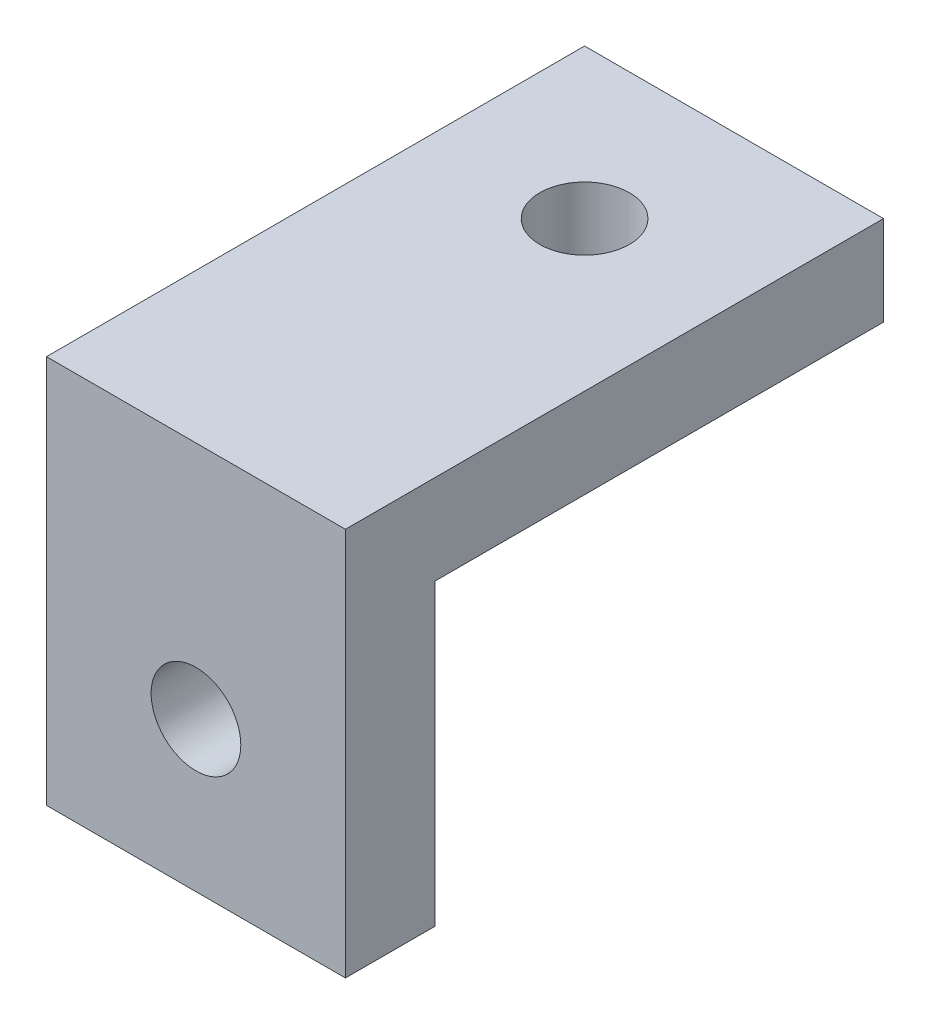
ISO-10303-21;
HEADER;
FILE_DESCRIPTION(('STEP AP214'),'2;1');
FILE_NAME('part.step','',(''),(''),'','','');
FILE_SCHEMA(('AUTOMOTIVE_DESIGN { 1 0 10303 214 1 1 1 1 }'));
ENDSEC;
DATA;
#1=APPLICATION_CONTEXT('core data for automotive mechanical design processes');
#2=APPLICATION_PROTOCOL_DEFINITION('international standard','automotive_design',2000,#1);
#3=PRODUCT_CONTEXT('',#1,'mechanical');
#4=PRODUCT('Part','Part','',(#3));
#5=PRODUCT_RELATED_PRODUCT_CATEGORY('part','',(#4));
#6=PRODUCT_DEFINITION_FORMATION('','',#4);
#7=PRODUCT_DEFINITION_CONTEXT('part definition',#1,'design');
#8=PRODUCT_DEFINITION('design','',#6,#7);
#9=PRODUCT_DEFINITION_SHAPE('','',#8);
#10=(LENGTH_UNIT() NAMED_UNIT(*) SI_UNIT(.MILLI.,.METRE.));
#11=(NAMED_UNIT(*) PLANE_ANGLE_UNIT() SI_UNIT($,.RADIAN.));
#12=(NAMED_UNIT(*) SI_UNIT($,.STERADIAN.) SOLID_ANGLE_UNIT());
#13=UNCERTAINTY_MEASURE_WITH_UNIT(LENGTH_MEASURE(1.E-05),#10,'distance_accuracy_value','');
#14=(GEOMETRIC_REPRESENTATION_CONTEXT(3) GLOBAL_UNCERTAINTY_ASSIGNED_CONTEXT((#13)) GLOBAL_UNIT_ASSIGNED_CONTEXT((#10,
#11,#12)) REPRESENTATION_CONTEXT('',''));
#15=CARTESIAN_POINT('',(0.,0.,0.));
#16=DIRECTION('',(0.,0.,1.));
#17=DIRECTION('',(1.,0.,0.));
#18=AXIS2_PLACEMENT_3D('',#15,#16,#17);
#19=CARTESIAN_POINT('',(0.,3.,0.));
#20=DIRECTION('',(0.,-1.,0.));
#21=DIRECTION('',(0.,0.,-1.));
#22=AXIS2_PLACEMENT_3D('',#19,#20,#21);
#23=PLANE('',#22);
#24=DIRECTION('',(0.,0.,-1.));
#25=VECTOR('',#24,1.);
#26=CARTESIAN_POINT('',(5.,3.,13.));
#27=LINE('',#26,#25);
#28=CARTESIAN_POINT('',(5.,3.,13.));
#29=VERTEX_POINT('',#28);
#30=CARTESIAN_POINT('',(5.,3.,-5.));
#31=VERTEX_POINT('',#30);
#32=EDGE_CURVE('E146',#29,#31,#27,.T.);
#33=ORIENTED_EDGE('',*,*,#32,.T.);
#34=DIRECTION('',(-1.,0.,0.));
#35=VECTOR('',#34,1.);
#36=CARTESIAN_POINT('',(-5.,3.,-5.));
#37=LINE('',#36,#35);
#38=CARTESIAN_POINT('',(-5.,3.,-5.));
#39=VERTEX_POINT('',#38);
#40=EDGE_CURVE('E89',#31,#39,#37,.T.);
#41=ORIENTED_EDGE('',*,*,#40,.T.);
#42=DIRECTION('',(0.,0.,1.));
#43=VECTOR('',#42,1.);
#44=CARTESIAN_POINT('',(-5.,3.,13.));
#45=LINE('',#44,#43);
#46=CARTESIAN_POINT('',(-5.,3.,13.));
#47=VERTEX_POINT('',#46);
#48=EDGE_CURVE('E151',#39,#47,#45,.T.);
#49=ORIENTED_EDGE('',*,*,#48,.T.);
#50=DIRECTION('',(1.,0.,0.));
#51=VECTOR('',#50,1.);
#52=CARTESIAN_POINT('',(-5.,3.,13.));
#53=LINE('',#52,#51);
#54=EDGE_CURVE('E69',#47,#29,#53,.T.);
#55=ORIENTED_EDGE('',*,*,#54,.T.);
#56=EDGE_LOOP('',(#33,#41,#49,#55));
#57=FACE_BOUND('',#56,.T.);
#58=CARTESIAN_POINT('',(0.,3.,0.));
#59=DIRECTION('',(0.,1.,0.));
#60=DIRECTION('',(0.,0.,1.));
#61=AXIS2_PLACEMENT_3D('',#58,#59,#60);
#62=CIRCLE('',#61,1.5);
#63=CARTESIAN_POINT('',(0.,3.,1.5));
#64=VERTEX_POINT('',#63);
#65=EDGE_CURVE('E137',#64,#64,#62,.T.);
#66=ORIENTED_EDGE('',*,*,#65,.F.);
#67=EDGE_LOOP('',(#66));
#68=FACE_BOUND('',#67,.T.);
#69=ADVANCED_FACE('F43',(#57,#68),#23,.F.);
#70=CARTESIAN_POINT('',(0.,0.,0.));
#71=DIRECTION('',(0.,-1.,0.));
#72=DIRECTION('',(0.,0.,-1.));
#73=AXIS2_PLACEMENT_3D('',#70,#71,#72);
#74=PLANE('',#73);
#75=DIRECTION('',(1.,0.,0.));
#76=VECTOR('',#75,1.);
#77=CARTESIAN_POINT('',(-5.,0.,10.));
#78=LINE('',#77,#76);
#79=CARTESIAN_POINT('',(-5.,0.,10.));
#80=VERTEX_POINT('',#79);
#81=CARTESIAN_POINT('',(5.,0.,10.));
#82=VERTEX_POINT('',#81);
#83=EDGE_CURVE('E60',#80,#82,#78,.T.);
#84=ORIENTED_EDGE('',*,*,#83,.F.);
#85=DIRECTION('',(0.,0.,1.));
#86=VECTOR('',#85,1.);
#87=CARTESIAN_POINT('',(-5.,0.,13.));
#88=LINE('',#87,#86);
#89=CARTESIAN_POINT('',(-5.,0.,-5.));
#90=VERTEX_POINT('',#89);
#91=EDGE_CURVE('E130',#90,#80,#88,.T.);
#92=ORIENTED_EDGE('',*,*,#91,.F.);
#93=DIRECTION('',(-1.,0.,0.));
#94=VECTOR('',#93,1.);
#95=CARTESIAN_POINT('',(-5.,0.,-5.));
#96=LINE('',#95,#94);
#97=CARTESIAN_POINT('',(5.,0.,-5.));
#98=VERTEX_POINT('',#97);
#99=EDGE_CURVE('E84',#98,#90,#96,.T.);
#100=ORIENTED_EDGE('',*,*,#99,.F.);
#101=DIRECTION('',(0.,0.,-1.));
#102=VECTOR('',#101,1.);
#103=CARTESIAN_POINT('',(5.,0.,13.));
#104=LINE('',#103,#102);
#105=EDGE_CURVE('E144',#82,#98,#104,.T.);
#106=ORIENTED_EDGE('',*,*,#105,.F.);
#107=EDGE_LOOP('',(#84,#92,#100,#106));
#108=FACE_BOUND('',#107,.T.);
#109=CARTESIAN_POINT('',(0.,0.,0.));
#110=DIRECTION('',(0.,1.,0.));
#111=DIRECTION('',(0.,0.,1.));
#112=AXIS2_PLACEMENT_3D('',#109,#110,#111);
#113=CIRCLE('',#112,1.5);
#114=CARTESIAN_POINT('',(0.,0.,1.5));
#115=VERTEX_POINT('',#114);
#116=EDGE_CURVE('E132',#115,#115,#113,.T.);
#117=ORIENTED_EDGE('',*,*,#116,.T.);
#118=EDGE_LOOP('',(#117));
#119=FACE_BOUND('',#118,.T.);
#120=ADVANCED_FACE('F170',(#108,#119),#74,.T.);
#121=CARTESIAN_POINT('',(5.,3.,13.));
#122=DIRECTION('',(-1.,0.,0.));
#123=DIRECTION('',(0.,0.,1.));
#124=AXIS2_PLACEMENT_3D('',#121,#122,#123);
#125=PLANE('',#124);
#126=DIRECTION('',(0.,-1.,0.));
#127=VECTOR('',#126,1.);
#128=CARTESIAN_POINT('',(5.,3.,13.));
#129=LINE('',#128,#127);
#130=CARTESIAN_POINT('',(5.,-10.,13.));
#131=VERTEX_POINT('',#130);
#132=EDGE_CURVE('E156',#29,#131,#129,.T.);
#133=ORIENTED_EDGE('',*,*,#132,.T.);
#134=DIRECTION('',(0.,0.,1.));
#135=VECTOR('',#134,1.);
#136=CARTESIAN_POINT('',(5.,-10.,13.));
#137=LINE('',#136,#135);
#138=CARTESIAN_POINT('',(5.,-10.,10.));
#139=VERTEX_POINT('',#138);
#140=EDGE_CURVE('E117',#139,#131,#137,.T.);
#141=ORIENTED_EDGE('',*,*,#140,.F.);
#142=DIRECTION('',(0.,1.,0.));
#143=VECTOR('',#142,1.);
#144=CARTESIAN_POINT('',(5.,-10.,10.));
#145=LINE('',#144,#143);
#146=EDGE_CURVE('E112',#139,#82,#145,.T.);
#147=ORIENTED_EDGE('',*,*,#146,.T.);
#148=ORIENTED_EDGE('',*,*,#105,.T.);
#149=DIRECTION('',(0.,-1.,0.));
#150=VECTOR('',#149,1.);
#151=CARTESIAN_POINT('',(5.,3.,-5.));
#152=LINE('',#151,#150);
#153=EDGE_CURVE('E11',#31,#98,#152,.T.);
#154=ORIENTED_EDGE('',*,*,#153,.F.);
#155=ORIENTED_EDGE('',*,*,#32,.F.);
#156=EDGE_LOOP('',(#133,#141,#147,#148,#154,#155));
#157=FACE_BOUND('',#156,.T.);
#158=ADVANCED_FACE('F45',(#157),#125,.F.);
#159=CARTESIAN_POINT('',(-5.,3.,-5.));
#160=DIRECTION('',(0.,0.,1.));
#161=DIRECTION('',(1.,0.,0.));
#162=AXIS2_PLACEMENT_3D('',#159,#160,#161);
#163=PLANE('',#162);
#164=ORIENTED_EDGE('',*,*,#99,.T.);
#165=DIRECTION('',(0.,-1.,0.));
#166=VECTOR('',#165,1.);
#167=CARTESIAN_POINT('',(-5.,3.,-5.));
#168=LINE('',#167,#166);
#169=EDGE_CURVE('E53',#39,#90,#168,.T.);
#170=ORIENTED_EDGE('',*,*,#169,.F.);
#171=ORIENTED_EDGE('',*,*,#40,.F.);
#172=ORIENTED_EDGE('',*,*,#153,.T.);
#173=EDGE_LOOP('',(#164,#170,#171,#172));
#174=FACE_BOUND('',#173,.T.);
#175=ADVANCED_FACE('F173',(#174),#163,.F.);
#176=CARTESIAN_POINT('',(-5.,3.,13.));
#177=DIRECTION('',(1.,0.,0.));
#178=DIRECTION('',(0.,0.,-1.));
#179=AXIS2_PLACEMENT_3D('',#176,#177,#178);
#180=PLANE('',#179);
#181=ORIENTED_EDGE('',*,*,#91,.T.);
#182=DIRECTION('',(0.,1.,0.));
#183=VECTOR('',#182,1.);
#184=CARTESIAN_POINT('',(-5.,-10.,10.));
#185=LINE('',#184,#183);
#186=CARTESIAN_POINT('',(-5.,-10.,10.));
#187=VERTEX_POINT('',#186);
#188=EDGE_CURVE('E110',#187,#80,#185,.T.);
#189=ORIENTED_EDGE('',*,*,#188,.F.);
#190=DIRECTION('',(0.,0.,-1.));
#191=VECTOR('',#190,1.);
#192=CARTESIAN_POINT('',(-5.,-10.,13.));
#193=LINE('',#192,#191);
#194=CARTESIAN_POINT('',(-5.,-10.,13.));
#195=VERTEX_POINT('',#194);
#196=EDGE_CURVE('E118',#195,#187,#193,.T.);
#197=ORIENTED_EDGE('',*,*,#196,.F.);
#198=DIRECTION('',(0.,-1.,0.));
#199=VECTOR('',#198,1.);
#200=CARTESIAN_POINT('',(-5.,3.,13.));
#201=LINE('',#200,#199);
#202=EDGE_CURVE('E165',#47,#195,#201,.T.);
#203=ORIENTED_EDGE('',*,*,#202,.F.);
#204=ORIENTED_EDGE('',*,*,#48,.F.);
#205=ORIENTED_EDGE('',*,*,#169,.T.);
#206=EDGE_LOOP('',(#181,#189,#197,#203,#204,#205));
#207=FACE_BOUND('',#206,.T.);
#208=ADVANCED_FACE('F129',(#207),#180,.F.);
#209=CARTESIAN_POINT('',(-5.,3.,13.));
#210=DIRECTION('',(0.,0.,-1.));
#211=DIRECTION('',(-1.,0.,0.));
#212=AXIS2_PLACEMENT_3D('',#209,#210,#211);
#213=PLANE('',#212);
#214=CARTESIAN_POINT('',(0.,-5.,13.));
#215=DIRECTION('',(0.,0.,1.));
#216=DIRECTION('',(1.,0.,0.));
#217=AXIS2_PLACEMENT_3D('',#214,#215,#216);
#218=CIRCLE('',#217,1.5);
#219=CARTESIAN_POINT('',(1.5,-5.,13.));
#220=VERTEX_POINT('',#219);
#221=EDGE_CURVE('E183',#220,#220,#218,.T.);
#222=ORIENTED_EDGE('',*,*,#221,.F.);
#223=EDGE_LOOP('',(#222));
#224=FACE_BOUND('',#223,.T.);
#225=ORIENTED_EDGE('',*,*,#202,.T.);
#226=DIRECTION('',(-1.,0.,0.));
#227=VECTOR('',#226,1.);
#228=CARTESIAN_POINT('',(-5.,-10.,13.));
#229=LINE('',#228,#227);
#230=EDGE_CURVE('E124',#131,#195,#229,.T.);
#231=ORIENTED_EDGE('',*,*,#230,.F.);
#232=ORIENTED_EDGE('',*,*,#132,.F.);
#233=ORIENTED_EDGE('',*,*,#54,.F.);
#234=EDGE_LOOP('',(#225,#231,#232,#233));
#235=FACE_BOUND('',#234,.T.);
#236=ADVANCED_FACE('F194',(#224,#235),#213,.F.);
#237=CARTESIAN_POINT('',(0.,3.,0.));
#238=DIRECTION('',(0.,-1.,0.));
#239=DIRECTION('',(0.,0.,-1.));
#240=AXIS2_PLACEMENT_3D('',#237,#238,#239);
#241=CYLINDRICAL_SURFACE('',#240,1.5);
#242=ORIENTED_EDGE('',*,*,#65,.T.);
#243=EDGE_LOOP('',(#242));
#244=FACE_BOUND('',#243,.T.);
#245=ORIENTED_EDGE('',*,*,#116,.F.);
#246=EDGE_LOOP('',(#245));
#247=FACE_BOUND('',#246,.T.);
#248=ADVANCED_FACE('F197',(#244,#247),#241,.F.);
#249=CARTESIAN_POINT('',(-5.,-10.,10.));
#250=DIRECTION('',(0.,0.,1.));
#251=DIRECTION('',(1.,0.,0.));
#252=AXIS2_PLACEMENT_3D('',#249,#250,#251);
#253=PLANE('',#252);
#254=CARTESIAN_POINT('',(0.,-5.,10.));
#255=DIRECTION('',(0.,0.,1.));
#256=DIRECTION('',(1.,0.,0.));
#257=AXIS2_PLACEMENT_3D('',#254,#255,#256);
#258=CIRCLE('',#257,1.5);
#259=CARTESIAN_POINT('',(1.5,-5.,10.));
#260=VERTEX_POINT('',#259);
#261=EDGE_CURVE('E47',#260,#260,#258,.T.);
#262=ORIENTED_EDGE('',*,*,#261,.T.);
#263=EDGE_LOOP('',(#262));
#264=FACE_BOUND('',#263,.T.);
#265=ORIENTED_EDGE('',*,*,#83,.T.);
#266=ORIENTED_EDGE('',*,*,#146,.F.);
#267=DIRECTION('',(1.,0.,0.));
#268=VECTOR('',#267,1.);
#269=CARTESIAN_POINT('',(-5.,-10.,10.));
#270=LINE('',#269,#268);
#271=EDGE_CURVE('E106',#187,#139,#270,.T.);
#272=ORIENTED_EDGE('',*,*,#271,.F.);
#273=ORIENTED_EDGE('',*,*,#188,.T.);
#274=EDGE_LOOP('',(#265,#266,#272,#273));
#275=FACE_BOUND('',#274,.T.);
#276=ADVANCED_FACE('F108',(#264,#275),#253,.F.);
#277=CARTESIAN_POINT('',(0.,-10.,0.));
#278=DIRECTION('',(0.,-1.,0.));
#279=DIRECTION('',(0.,0.,-1.));
#280=AXIS2_PLACEMENT_3D('',#277,#278,#279);
#281=PLANE('',#280);
#282=ORIENTED_EDGE('',*,*,#196,.T.);
#283=ORIENTED_EDGE('',*,*,#271,.T.);
#284=ORIENTED_EDGE('',*,*,#140,.T.);
#285=ORIENTED_EDGE('',*,*,#230,.T.);
#286=EDGE_LOOP('',(#282,#283,#284,#285));
#287=FACE_BOUND('',#286,.T.);
#288=ADVANCED_FACE('F122',(#287),#281,.T.);
#289=CARTESIAN_POINT('',(0.,-5.,-5.));
#290=DIRECTION('',(0.,0.,1.));
#291=DIRECTION('',(1.,0.,0.));
#292=AXIS2_PLACEMENT_3D('',#289,#290,#291);
#293=CYLINDRICAL_SURFACE('',#292,1.5);
#294=ORIENTED_EDGE('',*,*,#221,.T.);
#295=EDGE_LOOP('',(#294));
#296=FACE_BOUND('',#295,.T.);
#297=ORIENTED_EDGE('',*,*,#261,.F.);
#298=EDGE_LOOP('',(#297));
#299=FACE_BOUND('',#298,.T.);
#300=ADVANCED_FACE('F191',(#296,#299),#293,.F.);
#301=CLOSED_SHELL('',(#69,#120,#158,#175,#208,#236,#248,#276,#288,#300));
#302=MANIFOLD_SOLID_BREP('B2',#301);
#303=ADVANCED_BREP_SHAPE_REPRESENTATION('',(#18,#302),#14);
#304=SHAPE_DEFINITION_REPRESENTATION(#9,#303);
ENDSEC;
END-ISO-10303-21;
